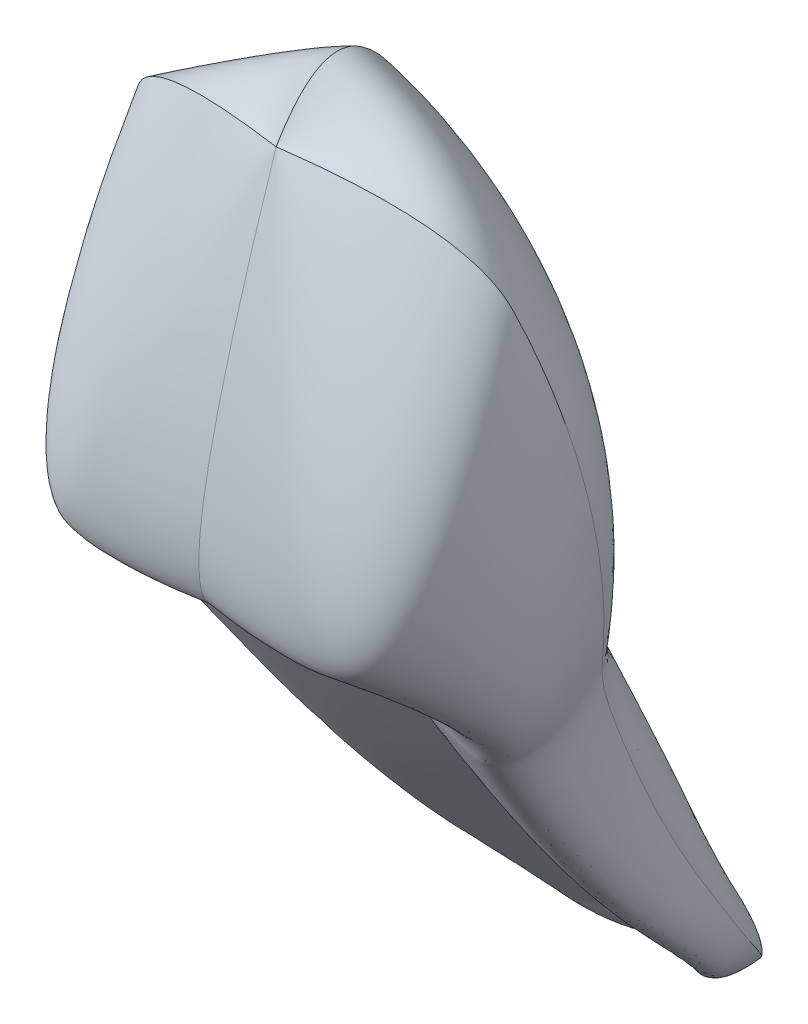
ISO-10303-21;
HEADER;
FILE_DESCRIPTION(('STEP AP214'),'2;1');
FILE_NAME('part.step','',(''),(''),'','','');
FILE_SCHEMA(('AUTOMOTIVE_DESIGN { 1 0 10303 214 1 1 1 1 }'));
ENDSEC;
DATA;
#1=APPLICATION_CONTEXT('core data for automotive mechanical design processes');
#2=APPLICATION_PROTOCOL_DEFINITION('international standard','automotive_design',2000,#1);
#3=PRODUCT_CONTEXT('',#1,'mechanical');
#4=PRODUCT('Part','Part','',(#3));
#5=PRODUCT_RELATED_PRODUCT_CATEGORY('part','',(#4));
#6=PRODUCT_DEFINITION_FORMATION('','',#4);
#7=PRODUCT_DEFINITION_CONTEXT('part definition',#1,'design');
#8=PRODUCT_DEFINITION('design','',#6,#7);
#9=PRODUCT_DEFINITION_SHAPE('','',#8);
#10=(LENGTH_UNIT() NAMED_UNIT(*) SI_UNIT(.MILLI.,.METRE.));
#11=(NAMED_UNIT(*) PLANE_ANGLE_UNIT() SI_UNIT($,.RADIAN.));
#12=(NAMED_UNIT(*) SI_UNIT($,.STERADIAN.) SOLID_ANGLE_UNIT());
#13=UNCERTAINTY_MEASURE_WITH_UNIT(LENGTH_MEASURE(1.E-05),#10,'distance_accuracy_value','');
#14=(GEOMETRIC_REPRESENTATION_CONTEXT(3) GLOBAL_UNCERTAINTY_ASSIGNED_CONTEXT((#13)) GLOBAL_UNIT_ASSIGNED_CONTEXT((#10,
#11,#12)) REPRESENTATION_CONTEXT('',''));
#15=CARTESIAN_POINT('',(0.,0.,0.));
#16=DIRECTION('',(0.,0.,1.));
#17=DIRECTION('',(1.,0.,0.));
#18=AXIS2_PLACEMENT_3D('',#15,#16,#17);
#19=CARTESIAN_POINT('',(-0.442008312540039,-230.047330925043,698.776855376468));
#20=CARTESIAN_POINT('',(-0.521462235696948,-270.186561539833,711.819726972035));
#21=CARTESIAN_POINT('',(-0.63376299136728,-280.170348342791,692.436844787852));
#22=CARTESIAN_POINT('',(-0.435320669660526,-284.064835897154,688.738625046415));
#23=CARTESIAN_POINT('',(-0.326654106740969,-309.70238284565,673.224565681323));
#24=CARTESIAN_POINT('',(-0.326654106740969,-329.155596318254,656.034050252693));
#25=CARTESIAN_POINT('',(-0.326654106740969,-335.816914858929,652.508382864654));
#26=CARTESIAN_POINT('',(-0.326654106740969,-337.033353735663,646.032564386077));
#27=CARTESIAN_POINT('',(-0.44200831254004,-230.047330925043,698.776855376468));
#28=CARTESIAN_POINT('',(-8.61464735503101,-270.621695366046,712.508229017021));
#29=CARTESIAN_POINT('',(-21.9444342998525,-281.793335648782,695.056166192246));
#30=CARTESIAN_POINT('',(-13.8211887354336,-289.365096393963,690.882263380302));
#31=CARTESIAN_POINT('',(-10.4043607260588,-311.420674536461,676.006974652497));
#32=CARTESIAN_POINT('',(-6.91460277826822,-329.751499567715,657.304402566194));
#33=CARTESIAN_POINT('',(-2.19906793420134,-335.839404422267,652.619325923999));
#34=CARTESIAN_POINT('',(-0.326654106740969,-337.033353735663,646.032564386077));
#35=CARTESIAN_POINT('',(-0.442008312540039,-230.047330925043,698.776855376468));
#36=CARTESIAN_POINT('',(-23.6611640265893,-265.128764238317,711.33274141417));
#37=CARTESIAN_POINT('',(-30.2154299263226,-279.35256710468,694.545687882062));
#38=CARTESIAN_POINT('',(-22.1064998816913,-288.759552781728,690.112782671695));
#39=CARTESIAN_POINT('',(-17.1736079784235,-311.309904013195,675.548041397517));
#40=CARTESIAN_POINT('',(-12.6236341284861,-329.560049186848,659.617156036508));
#41=CARTESIAN_POINT('',(-6.84774425839584,-337.001446680364,652.507207002736));
#42=CARTESIAN_POINT('',(-0.326654106740969,-337.033353735663,646.032564386077));
#43=CARTESIAN_POINT('',(-0.442008312540039,-230.047330925043,698.776855376468));
#44=CARTESIAN_POINT('',(-20.0252194416528,-230.387412393948,695.77622466595));
#45=CARTESIAN_POINT('',(-28.4437176150267,-258.12681396491,686.79081364888));
#46=CARTESIAN_POINT('',(-16.7658493474992,-287.449889501094,677.139133810344));
#47=CARTESIAN_POINT('',(-13.5959123569289,-306.682488838005,668.078996615542));
#48=CARTESIAN_POINT('',(-11.7129451788842,-325.827767085711,655.674301500962));
#49=CARTESIAN_POINT('',(-6.78217066595225,-337.758510313448,645.738201881493));
#50=CARTESIAN_POINT('',(-0.326654106740969,-337.033353735663,646.032564386077));
#51=(BOUNDED_SURFACE() B_SPLINE_SURFACE(2,2,((#19,#20,#21,#22,#23,#24,#25,#26),(#27,#28,#29,#30,
#31,#32,#33,#34),(#35,#36,#37,#38,#39,#40,#41,#42),(#43,#44,#45,#46,#47,#48,#49,#50)),
.UNSPECIFIED.,.F.,.F.,.F.) B_SPLINE_SURFACE_WITH_KNOTS((3,1,3),(3,1,1,1,1,1,3),
(3.14159265358979,3.68974117397993,4.71238898038469),(-1.5707963267949,-1.05220533721221,0.,
0.116900981042428,0.45584759311538,0.741777981877772,1.5707963267949),
.UNSPECIFIED.) GEOMETRIC_REPRESENTATION_ITEM() RATIONAL_B_SPLINE_SURFACE(((1.,0.935535124617778,
0.804737854124365,0.804737854124365,0.808954975739696,0.831496979097131,0.896946600754356,1.),
(0.897791342017914,0.839915335035491,0.72248667802693,0.72248667802693,0.72627277330141,
0.746510788747455,0.805270892409659,0.897791342017914),(0.809315439168634,0.757143020237719,
0.651286769826285,0.651286769826284,0.654699751458424,0.672943342805387,0.725912732100325,
0.809315439168634),(1.,0.935535124617778,0.804737854124365,0.804737854124365,0.808954975739696,
0.831496979097131,0.896946600754356,1.))) REPRESENTATION_ITEM('') SURFACE());
#52=CARTESIAN_POINT('',(-0.442008312540039,-230.047330925043,698.776855376468));
#53=CARTESIAN_POINT('',(-0.521462234334556,-270.186561539906,711.819726972148));
#54=CARTESIAN_POINT('',(-0.633762987783413,-280.170348343064,692.436844788291));
#55=CARTESIAN_POINT('',(-0.435320667383816,-284.064835898069,688.738625046785));
#56=CARTESIAN_POINT('',(-0.326654105002082,-309.702382845946,673.224565681803));
#57=CARTESIAN_POINT('',(-0.326654105604232,-329.155596318357,656.034050252912));
#58=CARTESIAN_POINT('',(-0.326654106417888,-335.816914858933,652.508382864673));
#59=CARTESIAN_POINT('',(-0.326654106740969,-337.033353735663,646.032564386077));
#60=(BOUNDED_CURVE() B_SPLINE_CURVE(2,(#52,#53,#54,#55,#56,#57,#58,#59),.UNSPECIFIED.,.F.,
.F.) B_SPLINE_CURVE_WITH_KNOTS((3,1,1,1,1,1,3),(-1.5707963267949,-1.05220533721221,0.,
0.116900981042428,0.45584759311538,0.741777981877772,1.5707963267949),
.UNSPECIFIED.) CURVE() GEOMETRIC_REPRESENTATION_ITEM() RATIONAL_B_SPLINE_CURVE((0.999999999980356,
0.935535124599401,0.804737854108557,0.804737854108557,0.808954975723805,0.831496979080798,
0.896946600736737,0.999999999980356)) REPRESENTATION_ITEM(''));
#61=CARTESIAN_POINT('',(-0.44200831254004,-230.047330925043,698.776855376468));
#62=VERTEX_POINT('',#61);
#63=CARTESIAN_POINT('',(-0.326654106740969,-337.033353735663,646.032564386077));
#64=VERTEX_POINT('',#63);
#65=EDGE_CURVE('E42',#62,#64,#60,.T.);
#66=CARTESIAN_POINT('',(-0.442008312540039,-230.047330925043,698.776855376468));
#67=CARTESIAN_POINT('',(-20.0252194416528,-230.387412393948,695.77622466595));
#68=CARTESIAN_POINT('',(-28.4437176150267,-258.12681396491,686.79081364888));
#69=CARTESIAN_POINT('',(-16.7658493474992,-287.449889501094,677.139133810344));
#70=CARTESIAN_POINT('',(-13.5959123569289,-306.682488838005,668.078996615542));
#71=CARTESIAN_POINT('',(-11.7129451788842,-325.827767085711,655.674301500962));
#72=CARTESIAN_POINT('',(-6.78217066595225,-337.758510313448,645.738201881493));
#73=CARTESIAN_POINT('',(-0.326654106740969,-337.033353735663,646.032564386077));
#74=(BOUNDED_CURVE() B_SPLINE_CURVE(2,(#66,#67,#68,#69,#70,#71,#72,#73),.UNSPECIFIED.,.F.,
.F.) B_SPLINE_CURVE_WITH_KNOTS((3,1,1,1,1,1,3),(-1.5707963267949,-1.05220533721221,0.,
0.116900981042428,0.45584759311538,0.741777981877772,1.5707963267949),
.UNSPECIFIED.) CURVE() GEOMETRIC_REPRESENTATION_ITEM() RATIONAL_B_SPLINE_CURVE((1.,
0.935535124617778,0.804737854124365,0.804737854124365,0.808954975739696,0.831496979097131,
0.896946600754356,1.)) REPRESENTATION_ITEM(''));
#75=EDGE_CURVE('E43',#62,#64,#74,.T.);
#76=ORIENTED_EDGE('',*,*,#65,.F.);
#77=ORIENTED_EDGE('',*,*,#75,.T.);
#78=EDGE_LOOP('',(#76,#77));
#79=FACE_BOUND('',#78,.T.);
#80=ADVANCED_FACE('F16',(#79),#51,.T.);
#81=CARTESIAN_POINT('',(-0.442008312540039,-230.047330925043,698.776855376468));
#82=CARTESIAN_POINT('',(-20.0252194416528,-230.387412393948,695.77622466595));
#83=CARTESIAN_POINT('',(-28.4437176150267,-258.12681396491,686.79081364888));
#84=CARTESIAN_POINT('',(-16.7658493474992,-287.449889501094,677.139133810344));
#85=CARTESIAN_POINT('',(-13.5959123569289,-306.682488838005,668.078996615542));
#86=CARTESIAN_POINT('',(-11.7129451788842,-325.827767085711,655.674301500962));
#87=CARTESIAN_POINT('',(-6.78217066595225,-337.758510313448,645.738201881493));
#88=CARTESIAN_POINT('',(-0.326654106740969,-337.033353735663,646.032564386077));
#89=CARTESIAN_POINT('',(-0.44200831254004,-230.047330925043,698.776855376468));
#90=CARTESIAN_POINT('',(-9.04420416512185,-227.131093767181,690.514973674271));
#91=CARTESIAN_POINT('',(-28.1188309611171,-249.024554216994,672.035723382284));
#92=CARTESIAN_POINT('',(-13.9598882417454,-283.653567593063,670.897990398088));
#93=CARTESIAN_POINT('',(-13.5959123569289,-304.455144788991,660.255566190757));
#94=CARTESIAN_POINT('',(-11.7129451788842,-317.387625837963,655.362283685104));
#95=CARTESIAN_POINT('',(-6.78217066595225,-336.381526166893,644.56657475043));
#96=CARTESIAN_POINT('',(-0.326654106740969,-337.033353735663,646.032564386077));
#97=CARTESIAN_POINT('',(-0.442008312540039,-230.047330925043,698.776855376468));
#98=CARTESIAN_POINT('',(-0.40940659359147,-221.711217307384,693.909066524843));
#99=CARTESIAN_POINT('',(-0.327038166302166,-231.314460310745,677.899858676672));
#100=CARTESIAN_POINT('',(-0.32665410674097,-283.320276531391,671.281548833746));
#101=CARTESIAN_POINT('',(-0.326654106740969,-304.222829996604,660.529590363288));
#102=CARTESIAN_POINT('',(-0.326654106740969,-317.243426212786,655.498097357232));
#103=CARTESIAN_POINT('',(-0.326654106740969,-335.937569706043,644.308329500977));
#104=CARTESIAN_POINT('',(-0.326654106740969,-337.033353735663,646.032564386077));
#105=(BOUNDED_SURFACE() B_SPLINE_SURFACE(2,2,((#81,#82,#83,#84,#85,#86,#87,#88),(#89,#90,#91,
#92,#93,#94,#95,#96),(#97,#98,#99,#100,#101,#102,#103,#104)),.UNSPECIFIED.,.F.,.F.,
.F.) B_SPLINE_SURFACE_WITH_KNOTS((3,3),(3,1,1,1,1,1,3),(4.71238898038469,6.28318530717959),
(-1.5707963267949,-1.05220533721221,0.,0.116900981042428,0.45584759311538,0.741777981877772,
1.5707963267949),.UNSPECIFIED.) GEOMETRIC_REPRESENTATION_ITEM() RATIONAL_B_SPLINE_SURFACE(((1.,
0.935535124617778,0.804737854124365,0.804737854124365,0.808954975739696,0.831496979097131,
0.896946600754356,1.),(0.707106781186547,0.661523230655433,0.569035593728849,0.569035593728849,
0.572017549020138,0.587957152455711,0.634237023755628,0.707106781186547),(1.,0.935535124617778,
0.804737854124365,0.804737854124365,0.808954975739696,0.831496979097131,0.896946600754356,1.))) REPRESENTATION_ITEM('') SURFACE());
#106=CARTESIAN_POINT('',(-0.326654106740969,-337.033353735663,646.032564386077));
#107=CARTESIAN_POINT('',(-0.326654106740645,-337.030123629031,646.027481370276));
#108=CARTESIAN_POINT('',(-0.326654106740321,-337.026801087649,646.022457049084));
#109=CARTESIAN_POINT('',(-0.326654106739674,-337.019977973357,646.01253736145));
#110=CARTESIAN_POINT('',(-0.326654106739352,-337.016477561154,646.00764188446));
#111=CARTESIAN_POINT('',(-0.326654106738707,-337.009298218827,645.997980279793));
#112=CARTESIAN_POINT('',(-0.326654106738385,-337.005619211073,645.993214209793));
#113=CARTESIAN_POINT('',(-0.326654106737743,-336.998082460576,645.983811647489));
#114=CARTESIAN_POINT('',(-0.326654106737422,-336.994224412058,645.979175400298));
#115=CARTESIAN_POINT('',(-0.326654106736782,-336.986329278209,645.970032732117));
#116=CARTESIAN_POINT('',(-0.326654106736462,-336.982291673014,645.965526760112));
#117=CARTESIAN_POINT('',(-0.326654106735824,-336.974037129147,645.956644864608));
#118=CARTESIAN_POINT('',(-0.326654106735505,-336.969819474094,645.95226960704));
#119=CARTESIAN_POINT('',(-0.326654106734869,-336.961204510627,645.943649353143));
#120=CARTESIAN_POINT('',(-0.326654106734551,-336.956806309642,645.939405249109));
#121=CARTESIAN_POINT('',(-0.326654106733917,-336.94782991534,645.93104750565));
#122=CARTESIAN_POINT('',(-0.3266541067336,-336.943250675763,645.926934990367));
#123=CARTESIAN_POINT('',(-0.326654106732969,-336.933911842445,645.918840623314));
#124=CARTESIAN_POINT('',(-0.326654106732653,-336.929151072671,645.914860129019));
#125=CARTESIAN_POINT('',(-0.326654106732023,-336.919448793693,645.907030002139));
#126=CARTESIAN_POINT('',(-0.326654106731709,-336.91450600329,645.903181957946));
#127=CARTESIAN_POINT('',(-0.326654106731081,-336.904439273364,645.895616932466));
#128=CARTESIAN_POINT('',(-0.326654106730767,-336.899313972061,645.891901764405));
#129=CARTESIAN_POINT('',(-0.326654106730142,-336.88888178811,645.884602699617));
#130=CARTESIAN_POINT('',(-0.326654106729829,-336.883573487049,645.881020831569));
#131=CARTESIAN_POINT('',(-0.326654106729206,-336.872774843654,645.87398858295));
#132=CARTESIAN_POINT('',(-0.326654106728894,-336.867283048944,645.87054043425));
#133=CARTESIAN_POINT('',(-0.326654106728273,-336.85611695497,645.863775860993));
#134=CARTESIAN_POINT('',(-0.326654106727963,-336.850441190682,645.860461857033));
#135=CARTESIAN_POINT('',(-0.326654106727344,-336.838906605426,645.853965794));
#136=CARTESIAN_POINT('',(-0.326654106727034,-336.83304632491,645.850786327454));
#137=CARTESIAN_POINT('',(-0.326654106726417,-336.821142401068,645.84455969274));
#138=CARTESIAN_POINT('',(-0.326654106726109,-336.815097324517,645.841515273152));
#139=CARTESIAN_POINT('',(-0.326654106725179,-336.796535294413,645.832507674649));
#140=CARTESIAN_POINT('',(-0.326654106724566,-336.783878208421,645.826831044932));
#141=CARTESIAN_POINT('',(-0.326654106723344,-336.757830131521,645.81599931722));
#142=CARTESIAN_POINT('',(-0.326654106722735,-336.744428899408,645.810869055859));
#143=CARTESIAN_POINT('',(-0.326654106721522,-336.716886383349,645.801131340633));
#144=CARTESIAN_POINT('',(-0.326654106720918,-336.702735954726,645.796549854446));
#145=CARTESIAN_POINT('',(-0.326654106719713,-336.673690184114,645.787912287474));
#146=CARTESIAN_POINT('',(-0.326654106719113,-336.658786978733,645.783882814419));
#147=CARTESIAN_POINT('',(-0.326654106717917,-336.628230298696,645.77635213331));
#148=CARTESIAN_POINT('',(-0.326654106717322,-336.612570262656,645.772877720336));
#149=CARTESIAN_POINT('',(-0.326654106716135,-336.580494694369,645.766460485474));
#150=CARTESIAN_POINT('',(-0.326654106715544,-336.564073876081,645.763544285933));
#151=CARTESIAN_POINT('',(-0.326654106714366,-336.530471544446,645.758247097287));
#152=CARTESIAN_POINT('',(-0.326654106713779,-336.513285942226,645.755892273437));
#153=CARTESIAN_POINT('',(-0.326654106712609,-336.478148995777,645.751721742467));
#154=CARTESIAN_POINT('',(-0.326654106712027,-336.46019465862,645.749931533748));
#155=CARTESIAN_POINT('',(-0.326654106710866,-336.423515189786,645.746894161095));
#156=CARTESIAN_POINT('',(-0.326654106710289,-336.404788040063,645.745671672498));
#157=CARTESIAN_POINT('',(-0.326654106709137,-336.36655856223,645.743774389344));
#158=CARTESIAN_POINT('',(-0.326654106708564,-336.347055093939,645.743123372109));
#159=CARTESIAN_POINT('',(-0.326654106706815,-336.286200866729,645.741973219323));
#160=CARTESIAN_POINT('',(-0.326654106705685,-336.244830134914,645.74245963562));
#161=CARTESIAN_POINT('',(-0.326654106703433,-336.15893786717,645.745584404141));
#162=CARTESIAN_POINT('',(-0.326654106702321,-336.114423190794,645.748388225928));
#163=CARTESIAN_POINT('',(-0.326654106700106,-336.022200084394,645.756190653053));
#164=CARTESIAN_POINT('',(-0.32665410669901,-335.974504678875,645.761339186648));
#165=CARTESIAN_POINT('',(-0.326654106696832,-335.875885887478,645.773871487336));
#166=CARTESIAN_POINT('',(-0.326654106695755,-335.824980050158,645.781390599995));
#167=CARTESIAN_POINT('',(-0.326654106693613,-335.719906888994,645.798703706283));
#168=CARTESIAN_POINT('',(-0.326654106692554,-335.665759939939,645.808619856779));
#169=CARTESIAN_POINT('',(-0.326654106690449,-335.554173026769,645.830764100117));
#170=CARTESIAN_POINT('',(-0.326654106689408,-335.496755137506,645.843102490286));
#171=CARTESIAN_POINT('',(-0.32665410668734,-335.378597832916,645.870130184492));
#172=CARTESIAN_POINT('',(-0.326654106686318,-335.317881481016,645.884919496296));
#173=CARTESIAN_POINT('',(-0.32665410668318,-335.125061249231,645.934291924253));
#174=CARTESIAN_POINT('',(-0.326654106681203,-334.993644357992,645.971558592169));
#175=CARTESIAN_POINT('',(-0.32665410667729,-334.717109261462,646.055541164711));
#176=CARTESIAN_POINT('',(-0.326654106675387,-334.572175273667,646.102851966324));
#177=CARTESIAN_POINT('',(-0.326654106671626,-334.268392806578,646.207225882728));
#178=CARTESIAN_POINT('',(-0.326654106669797,-334.109717902904,646.264790765271));
#179=CARTESIAN_POINT('',(-0.326654106666191,-333.778273920816,646.389949913914));
#180=CARTESIAN_POINT('',(-0.326654106664438,-333.60566788986,646.457972641417));
#181=CARTESIAN_POINT('',(-0.326654106659027,-333.042357488565,646.687131336962));
#182=CARTESIAN_POINT('',(-0.326654106655801,-332.654871759118,646.856153413002));
#183=CARTESIAN_POINT('',(-0.326654106649527,-331.820986922258,647.235596960263));
#184=CARTESIAN_POINT('',(-0.326654106646599,-331.375601865182,647.448208416921));
#185=CARTESIAN_POINT('',(-0.32665410664096,-330.424884989236,647.916634185225));
#186=CARTESIAN_POINT('',(-0.326654106638343,-329.92041630811,648.174191085011));
#187=CARTESIAN_POINT('',(-0.326654106633347,-328.850705009052,648.733899313555));
#188=CARTESIAN_POINT('',(-0.326654106631045,-328.286203250461,649.037458097855));
#189=CARTESIAN_POINT('',(-0.326654106626694,-327.095810250995,649.690321225608));
#190=CARTESIAN_POINT('',(-0.326654106624709,-326.470558917866,650.040788222361));
#191=CARTESIAN_POINT('',(-0.326654106621005,-325.158295797481,650.788364129724));
#192=CARTESIAN_POINT('',(-0.326654106619337,-324.47184113884,651.186448474206));
#193=CARTESIAN_POINT('',(-0.326654106617094,-323.420750745321,651.804308646619));
#194=CARTESIAN_POINT('',(-0.326654106616371,-323.054420260539,652.02121171032));
#195=CARTESIAN_POINT('',(-0.326654106615528,-322.59470500739,652.295225225784));
#196=CARTESIAN_POINT('',(-0.32665410661536,-322.500725102058,652.351337742503));
#197=CARTESIAN_POINT('',(-0.326654106615027,-322.311952950007,652.464179000815));
#198=CARTESIAN_POINT('',(-0.326654106614863,-322.217161236745,652.52090863842));
#199=CARTESIAN_POINT('',(-0.326654106614379,-321.931367898607,652.690818347162));
#200=CARTESIAN_POINT('',(-0.326654106614065,-321.739866133412,652.80315880595));
#201=CARTESIAN_POINT('',(-0.326654106613459,-321.354652073448,653.026624671578));
#202=CARTESIAN_POINT('',(-0.326654106613166,-321.160933401556,653.13773906661));
#203=CARTESIAN_POINT('',(-0.326654106612599,-320.771242827049,653.358633734065));
#204=CARTESIAN_POINT('',(-0.326654106612325,-320.575264372379,653.468402453698));
#205=CARTESIAN_POINT('',(-0.326654106611532,-319.982295486315,653.796643974016));
#206=CARTESIAN_POINT('',(-0.326654106611044,-319.583635506376,654.0121007232));
#207=CARTESIAN_POINT('',(-0.326654106609688,-318.367706050059,654.653797833512));
#208=CARTESIAN_POINT('',(-0.326654106608948,-317.543834270948,655.067625668112));
#209=CARTESIAN_POINT('',(-0.326654106608065,-316.289724648619,655.667624281081));
#210=CARTESIAN_POINT('',(-0.326654106607807,-315.86511547619,655.865686819287));
#211=CARTESIAN_POINT('',(-0.326654106607477,-315.223694036337,656.157438240248));
#212=CARTESIAN_POINT('',(-0.326654106607376,-315.008267559728,656.254173180258));
#213=CARTESIAN_POINT('',(-0.326654106607192,-314.575359833442,656.446087436889));
#214=CARTESIAN_POINT('',(-0.32665410660711,-314.357873741517,656.541255828913));
#215=CARTESIAN_POINT('',(-0.326654106606963,-313.920869483952,656.730013865442));
#216=CARTESIAN_POINT('',(-0.326654106606899,-313.701346637351,656.823592672282));
#217=CARTESIAN_POINT('',(-0.32665410660679,-313.260293674868,657.009151407579));
#218=CARTESIAN_POINT('',(-0.326654106606744,-313.038759045254,657.101120605684));
#219=CARTESIAN_POINT('',(-0.32665410660667,-312.593703451316,657.283430174507));
#220=CARTESIAN_POINT('',(-0.326654106606643,-312.370178115585,657.373759876582));
#221=CARTESIAN_POINT('',(-0.326654106606614,-312.033850228335,657.507871638338));
#222=CARTESIAN_POINT('',(-0.326654106606607,-311.921355630525,657.552427359943));
#223=CARTESIAN_POINT('',(-0.326654106606597,-311.695866569699,657.64109032356));
#224=CARTESIAN_POINT('',(-0.326654106606595,-311.582871559434,657.685196173311));
#225=CARTESIAN_POINT('',(-0.326654106606594,-311.355593532999,657.773450437642));
#226=CARTESIAN_POINT('',(-0.326654106606595,-311.24130896069,657.817594846224));
#227=CARTESIAN_POINT('',(-0.326654106606603,-311.009609256848,657.908066907421));
#228=CARTESIAN_POINT('',(-0.32665410660661,-310.89220412036,657.954420193181));
#229=CARTESIAN_POINT('',(-0.326654106606635,-310.529568127898,658.098604632461));
#230=CARTESIAN_POINT('',(-0.326654106606661,-310.284716493914,658.197389113406));
#231=CARTESIAN_POINT('',(-0.326654106606729,-309.781611973718,658.403073014725));
#232=CARTESIAN_POINT('',(-0.326654106606773,-309.523414850336,658.510108688477));
#233=CARTESIAN_POINT('',(-0.326654106606875,-308.993590687865,658.732274017595));
#234=CARTESIAN_POINT('',(-0.326654106606935,-308.722013826292,658.847523136063));
#235=CARTESIAN_POINT('',(-0.326654106607146,-307.865673581496,659.214650134943));
#236=CARTESIAN_POINT('',(-0.326654106607323,-307.282473183708,659.470175197317));
#237=CARTESIAN_POINT('',(-0.326654106607724,-306.062186255523,660.013486223828));
#238=CARTESIAN_POINT('',(-0.326654106607951,-305.425416511311,660.301980704927));
#239=CARTESIAN_POINT('',(-0.326654106608521,-304.098084966813,660.911412523089));
#240=CARTESIAN_POINT('',(-0.326654106608872,-303.407797500624,661.232946394678));
#241=CARTESIAN_POINT('',(-0.326654106609403,-301.973581829145,661.908547203263));
#242=CARTESIAN_POINT('',(-0.326654106609567,-301.229892867223,662.263121115206));
#243=CARTESIAN_POINT('',(-0.326654106610917,-299.68908769996,663.004836385179));
#244=CARTESIAN_POINT('',(-0.326654106612178,-298.892181639302,663.392413754515));
#245=CARTESIAN_POINT('',(-0.326654106610752,-297.245219194143,664.200111606505));
#246=CARTESIAN_POINT('',(-0.326654106607782,-296.395348564665,664.620610443318));
#247=CARTESIAN_POINT('',(-0.326654106618426,-294.642796142476,665.494071366271));
#248=CARTESIAN_POINT('',(-0.326654106633133,-293.740279328295,665.947364259638));
#249=CARTESIAN_POINT('',(-0.326654106604838,-292.367714392187,666.641192922374));
#250=CARTESIAN_POINT('',(-0.326654106586025,-291.89680875793,666.880034880679));
#251=CARTESIAN_POINT('',(-0.326654106645667,-290.941968832544,667.365816435576));
#252=CARTESIAN_POINT('',(-0.326654106726954,-290.458051976244,667.612790305985));
#253=CARTESIAN_POINT('',(-0.326654106559854,-289.727535451962,667.986721008897));
#254=CARTESIAN_POINT('',(-0.326654106453362,-289.480717071206,668.113250455521));
#255=CARTESIAN_POINT('',(-0.326654106699356,-289.109323433546,668.303891306864));
#256=CARTESIAN_POINT('',(-0.326654106850789,-288.98469789237,668.367905314397));
#257=CARTESIAN_POINT('',(-0.326654106382213,-288.734929169097,668.496331959783));
#258=CARTESIAN_POINT('',(-0.326654105758669,-288.60978623016,668.560745080651));
#259=CARTESIAN_POINT('',(-0.326654155105528,-288.235321413034,668.7507913413));
#260=CARTESIAN_POINT('',(-0.326654255442752,-287.984927525592,668.874323609151));
#261=CARTESIAN_POINT('',(-0.326654580052908,-287.484685745929,669.114619217436));
#262=CARTESIAN_POINT('',(-0.326654802793674,-287.234868691245,669.231446907002));
#263=CARTESIAN_POINT('',(-0.326655375987015,-286.735702576983,669.458164487513));
#264=CARTESIAN_POINT('',(-0.326655724879084,-286.486383704601,669.568120681038));
#265=CARTESIAN_POINT('',(-0.326656549408014,-285.988255707186,669.7811274798));
#266=CARTESIAN_POINT('',(-0.326657023518785,-285.73947456668,669.884243681118));
#267=CARTESIAN_POINT('',(-0.326658627424415,-284.99802651699,670.181555308049));
#268=CARTESIAN_POINT('',(-0.326659948096123,-284.502003654349,670.367470443858));
#269=CARTESIAN_POINT('',(-0.326663103449501,-283.511979860078,670.711319642334));
#270=CARTESIAN_POINT('',(-0.326664926753461,-283.018155249855,670.869759357433));
#271=CARTESIAN_POINT('',(-0.326668060958463,-282.275563626516,671.087434228497));
#272=CARTESIAN_POINT('',(-0.326669162555531,-282.029568713555,671.156220290827));
#273=CARTESIAN_POINT('',(-0.326671492832021,-281.538146316318,671.286856183067));
#274=CARTESIAN_POINT('',(-0.326672720256562,-281.292734231364,671.348763714768));
#275=CARTESIAN_POINT('',(-0.326675300590483,-280.802494497222,671.465634607563));
#276=CARTESIAN_POINT('',(-0.326676652328543,-280.557680006545,671.520653164741));
#277=CARTESIAN_POINT('',(-0.326679486709105,-280.068649226522,671.623762312644));
#278=CARTESIAN_POINT('',(-0.326680968212375,-279.824443939293,671.671905023206));
#279=CARTESIAN_POINT('',(-0.326684041616034,-279.336631499254,671.761203633291));
#280=CARTESIAN_POINT('',(-0.326685632614421,-279.093033382855,671.802408785495));
#281=CARTESIAN_POINT('',(-0.326688162466448,-278.727513839053,671.859236725729));
#282=CARTESIAN_POINT('',(-0.32668902721065,-278.605969694686,671.877308837051));
#283=CARTESIAN_POINT('',(-0.326690707608154,-278.363007530415,671.911489085868));
#284=CARTESIAN_POINT('',(-0.326691523411288,-278.24159037558,671.927603390748));
#285=CARTESIAN_POINT('',(-0.326693492509875,-277.999012363608,671.959001118104));
#286=CARTESIAN_POINT('',(-0.32669464481391,-277.877851791994,671.974286827176));
#287=CARTESIAN_POINT('',(-0.326697674582296,-277.635906193252,672.00516536449));
#288=CARTESIAN_POINT('',(-0.326699550053873,-277.515121045649,672.020757237971));
#289=CARTESIAN_POINT('',(-0.326706112796095,-277.153778315971,672.067512061462));
#290=CARTESIAN_POINT('',(-0.32671174402984,-276.913234814938,672.09878221682));
#291=CARTESIAN_POINT('',(-0.326725608719083,-276.43355244582,672.161656764589));
#292=CARTESIAN_POINT('',(-0.326733827522817,-276.194413208492,672.193258329583));
#293=CARTESIAN_POINT('',(-0.32675284752793,-275.717541530982,672.256736976906));
#294=CARTESIAN_POINT('',(-0.326763633930385,-275.479808750272,672.288611506517));
#295=CARTESIAN_POINT('',(-0.326799768443117,-274.7707761967,672.384391921371));
#296=CARTESIAN_POINT('',(-0.326829008760752,-274.299569409963,672.448988451697));
#297=CARTESIAN_POINT('',(-0.326897887797812,-273.362899535281,672.579324419118));
#298=CARTESIAN_POINT('',(-0.326937401642059,-272.897433375879,672.645041830232));
#299=CARTESIAN_POINT('',(-0.32707071000948,-271.518121965938,672.842696086586));
#300=CARTESIAN_POINT('',(-0.327180107455158,-270.604668799047,672.97738761358));
#301=CARTESIAN_POINT('',(-0.327440910714441,-268.801575862363,673.251319352763));
#302=CARTESIAN_POINT('',(-0.327591209599334,-267.911906352412,673.390364428622));
#303=CARTESIAN_POINT('',(-0.328097984823302,-265.314285965922,673.80854974307));
#304=CARTESIAN_POINT('',(-0.328516798147408,-263.608080215816,674.098670919516));
#305=CARTESIAN_POINT('',(-0.329525349717335,-260.296758995493,674.696894019659));
#306=CARTESIAN_POINT('',(-0.330104278961503,-258.691301837097,675.003096832585));
#307=CARTESIAN_POINT('',(-0.331431712450364,-255.584680025417,675.632837475558));
#308=CARTESIAN_POINT('',(-0.332167846996066,-254.083078817673,675.954207713108));
#309=CARTESIAN_POINT('',(-0.333807742762295,-251.186846824543,676.61359586986));
#310=CARTESIAN_POINT('',(-0.334697351036655,-249.791656890076,676.949141225596));
#311=CARTESIAN_POINT('',(-0.336641813743074,-247.110385925171,677.636182588899));
#312=CARTESIAN_POINT('',(-0.337680464684442,-245.823587195701,677.984857560795));
#313=CARTESIAN_POINT('',(-0.339920254999642,-243.36068802945,678.697462493131));
#314=CARTESIAN_POINT('',(-0.341102831113635,-242.183664470415,679.058173288066));
#315=CARTESIAN_POINT('',(-0.343627533653182,-239.941438137132,679.794180589789));
#316=CARTESIAN_POINT('',(-0.34494837534789,-238.875038241871,680.165803447086));
#317=CARTESIAN_POINT('',(-0.347746339717976,-236.854524818308,680.922988812467));
#318=CARTESIAN_POINT('',(-0.349199079493376,-235.898867036827,681.304364712546));
#319=CARTESIAN_POINT('',(-0.351550781422069,-234.516310378696,681.901025853604));
#320=CARTESIAN_POINT('',(-0.35232924166878,-234.080533819919,682.095777499308));
#321=CARTESIAN_POINT('',(-0.353920755470232,-233.236892158482,682.487981460752));
#322=CARTESIAN_POINT('',(-0.354730054616566,-232.828732033096,682.684796343556));
#323=CARTESIAN_POINT('',(-0.356382495918548,-232.040250486433,683.081001128634));
#324=CARTESIAN_POINT('',(-0.357221643517793,-231.659590906171,683.27971588087));
#325=CARTESIAN_POINT('',(-0.358933167088468,-230.926013429069,683.679622185968));
#326=CARTESIAN_POINT('',(-0.359801298124296,-230.572707878812,683.880099834075));
#327=CARTESIAN_POINT('',(-0.36157011866298,-229.893718929498,684.283426616556));
#328=CARTESIAN_POINT('',(-0.362466319419942,-229.567591463096,684.485525143151));
#329=CARTESIAN_POINT('',(-0.364290607000771,-228.942814245795,684.891991056172));
#330=CARTESIAN_POINT('',(-0.365213975863373,-228.64365703732,685.09557463274));
#331=CARTESIAN_POINT('',(-0.36709185697832,-228.072666760843,685.50489654289));
#332=CARTESIAN_POINT('',(-0.368041455701696,-227.800255310895,685.709824859104));
#333=CARTESIAN_POINT('',(-0.369971128103643,-227.282544965439,686.121742791312));
#334=CARTESIAN_POINT('',(-0.370946138808775,-227.036593279462,686.327904908542));
#335=CARTESIAN_POINT('',(-0.37245297344069,-226.68268032529,686.64322033137));
#336=CARTESIAN_POINT('',(-0.372950314045847,-226.569737377052,686.746805089932));
#337=CARTESIAN_POINT('',(-0.373951619426992,-226.350469161552,686.9543314372));
#338=CARTESIAN_POINT('',(-0.374454944760592,-226.244046986469,687.058170335857));
#339=CARTESIAN_POINT('',(-0.375468071886461,-226.037788097514,687.266182477382));
#340=CARTESIAN_POINT('',(-0.375977240525906,-225.937849693275,687.370254762666));
#341=CARTESIAN_POINT('',(-0.377001931830088,-225.744522571746,687.578716194076));
#342=CARTESIAN_POINT('',(-0.377516831540175,-225.651027751167,687.683006770454));
#343=CARTESIAN_POINT('',(-0.378552843112663,-225.470549308342,687.891884103581));
#344=CARTESIAN_POINT('',(-0.379073347950089,-225.383455679483,687.996375645398));
#345=CARTESIAN_POINT('',(-0.380120448590695,-225.215744630996,688.205637669637));
#346=CARTESIAN_POINT('',(-0.380646458337203,-225.135013826503,688.310317126495));
#347=CARTESIAN_POINT('',(-0.38170435273737,-224.979971568457,688.519922860535));
#348=CARTESIAN_POINT('',(-0.382235680869257,-224.905544797256,688.624763674948));
#349=CARTESIAN_POINT('',(-0.383304305228089,-224.763122507955,688.834709014502));
#350=CARTESIAN_POINT('',(-0.383841072291901,-224.6950089825,688.939733287751));
#351=CARTESIAN_POINT('',(-0.384654925833108,-224.596874131716,689.098321758105));
#352=CARTESIAN_POINT('',(-0.384924903365337,-224.56513479972,689.150826751648));
#353=CARTESIAN_POINT('',(-0.385466491619045,-224.50374579562,689.255878156261));
#354=CARTESIAN_POINT('',(-0.385737999979212,-224.474070098009,689.308409267425));
#355=CARTESIAN_POINT('',(-0.386282370188517,-224.416846281889,689.413458026918));
#356=CARTESIAN_POINT('',(-0.386555129888265,-224.389270499802,689.465960609695));
#357=CARTESIAN_POINT('',(-0.387101977200958,-224.336234588841,689.57094911283));
#358=CARTESIAN_POINT('',(-0.38737597013261,-224.310747234137,689.623421261354));
#359=CARTESIAN_POINT('',(-0.387925261591521,-224.261879678508,689.728345910215));
#360=CARTESIAN_POINT('',(-0.388200473369332,-224.238472848152,689.780785996148));
#361=CARTESIAN_POINT('',(-0.38875217868768,-224.193756548787,689.885643406647));
#362=CARTESIAN_POINT('',(-0.3890285938571,-224.172421297726,689.938049724516));
#363=CARTESIAN_POINT('',(-0.389582681985037,-224.131838287258,690.042836472495));
#364=CARTESIAN_POINT('',(-0.389860285257074,-224.112565836168,690.095207329382));
#365=CARTESIAN_POINT('',(-0.390416725274845,-224.076098149432,690.199920015856));
#366=CARTESIAN_POINT('',(-0.390695501187718,-224.058879566427,690.252253705433));
#367=CARTESIAN_POINT('',(-0.391254262069091,-224.026509014419,690.356888938789));
#368=CARTESIAN_POINT('',(-0.391534195065035,-224.011335295314,690.409183746366));
#369=CARTESIAN_POINT('',(-0.392095245739738,-223.983043526098,690.513738146909));
#370=CARTESIAN_POINT('',(-0.392376320138026,-223.969905569607,690.565992347333));
#371=CARTESIAN_POINT('',(-0.392939629479518,-223.94567405372,690.670462546667));
#372=CARTESIAN_POINT('',(-0.393221829482993,-223.934562663852,690.722674405269));
#373=CARTESIAN_POINT('',(-0.393787366320158,-223.91437269948,690.827057047832));
#374=CARTESIAN_POINT('',(-0.394070676020208,-223.90527858074,690.879224821894));
#375=CARTESIAN_POINT('',(-0.394638409147377,-223.889111293793,690.98351656674));
#376=CARTESIAN_POINT('',(-0.394922812537102,-223.88202504861,691.035638508178));
#377=CARTESIAN_POINT('',(-0.395492710729132,-223.869861394429,691.139836031491));
#378=CARTESIAN_POINT('',(-0.395778191722066,-223.864773520714,691.191910390528));
#379=CARTESIAN_POINT('',(-0.396350223752324,-223.856594285829,691.296010388653));
#380=CARTESIAN_POINT('',(-0.396636766206714,-223.8534951756,691.348035418359));
#381=CARTESIAN_POINT('',(-0.397210900867812,-223.849280980106,691.452034611248));
#382=CARTESIAN_POINT('',(-0.39749848861514,-223.848160919243,691.504008572713));
#383=CARTESIAN_POINT('',(-0.398074694741416,-223.84789221977,691.607903707621));
#384=CARTESIAN_POINT('',(-0.398363311617648,-223.848741389097,691.659824875457));
#385=CARTESIAN_POINT('',(-0.398941558108379,-223.852398482449,691.763612730687));
#386=CARTESIAN_POINT('',(-0.399231187986129,-223.855206960182,691.815479398527));
#387=CARTESIAN_POINT('',(-0.399811443828351,-223.862769987633,691.919156787018));
#388=CARTESIAN_POINT('',(-0.400102070648096,-223.867527753144,691.970967272689));
#389=CARTESIAN_POINT('',(-0.400684304937921,-223.878976705314,692.074531045275));
#390=CARTESIAN_POINT('',(-0.400975912736462,-223.885673644046,692.126283695334));
#391=CARTESIAN_POINT('',(-0.401560094698059,-223.900988366289,692.229730743507));
#392=CARTESIAN_POINT('',(-0.401852667632931,-223.909614275591,692.281423936934));
#393=CARTESIAN_POINT('',(-0.402438766634004,-223.928774473698,692.38475119495));
#394=CARTESIAN_POINT('',(-0.4027322890022,-223.939319069249,692.436383345744));
#395=CARTESIAN_POINT('',(-0.403320274567109,-223.962304315469,692.539587792255));
#396=CARTESIAN_POINT('',(-0.403614730819719,-223.974757238148,692.591157351243));
#397=CARTESIAN_POINT('',(-0.40420457263411,-224.001546976837,692.694236009451));
#398=CARTESIAN_POINT('',(-0.404499947378648,-224.01589779902,692.745741463946));
#399=CARTESIAN_POINT('',(-0.405091615308102,-224.04647135379,692.848691404096));
#400=CARTESIAN_POINT('',(-0.405387893329702,-224.062709587575,692.900131280723));
#401=CARTESIAN_POINT('',(-0.405981357368163,-224.097046162191,693.002949610702));
#402=CARTESIAN_POINT('',(-0.406278523553672,-224.115161258808,693.054322461784));
#403=CARTESIAN_POINT('',(-0.406873754021978,-224.15323996063,693.157006360068));
#404=CARTESIAN_POINT('',(-0.407171793629675,-224.173221340789,693.208310808572));
#405=CARTESIAN_POINT('',(-0.407768760413484,-224.215021117303,693.310857394541));
#406=CARTESIAN_POINT('',(-0.408067658014284,-224.2368580811,693.362091954133));
#407=CARTESIAN_POINT('',(-0.408666333435789,-224.282357984397,693.4644987737));
#408=CARTESIAN_POINT('',(-0.408966076886049,-224.306040075089,693.515662520828));
#409=CARTESIAN_POINT('',(-0.409566424767598,-224.35521827896,693.617925694072));
#410=CARTESIAN_POINT('',(-0.409866990047563,-224.380733917975,693.669015700238));
#411=CARTESIAN_POINT('',(-0.410776238580979,-224.460536405608,693.823253154047));
#412=CARTESIAN_POINT('',(-0.411379917401214,-224.517120329393,693.925220570594));
#413=CARTESIAN_POINT('',(-0.412590737725335,-224.637332752704,694.128927096444));
#414=CARTESIAN_POINT('',(-0.413197466168616,-224.701118643415,694.230572704602));
#415=CARTESIAN_POINT('',(-0.414414385617946,-224.835655109383,694.433645259527));
#416=CARTESIAN_POINT('',(-0.415024114341264,-224.906559088422,694.534970315251));
#417=CARTESIAN_POINT('',(-0.416246952993919,-225.055248751038,694.737397141966));
#418=CARTESIAN_POINT('',(-0.416859561978648,-225.133181022115,694.838390877852));
#419=CARTESIAN_POINT('',(-0.418088087367646,-225.295847580993,695.040151407718));
#420=CARTESIAN_POINT('',(-0.418703476931089,-225.380719999493,695.140806522093));
#421=CARTESIAN_POINT('',(-0.419937473852151,-225.557187543892,695.341883250969));
#422=CARTESIAN_POINT('',(-0.420555539220416,-225.648911397661,695.442191593139));
#423=CARTESIAN_POINT('',(-0.421794787900609,-225.839002776159,695.642566343504));
#424=CARTESIAN_POINT('',(-0.422415423374664,-225.937489268533,695.742519606242));
#425=CARTESIAN_POINT('',(-0.423659712834371,-226.141026711429,695.942175860412));
#426=CARTESIAN_POINT('',(-0.424282821054085,-226.246186919518,696.041767254877));
#427=CARTESIAN_POINT('',(-0.42553191637123,-226.462991460902,696.240684324232));
#428=CARTESIAN_POINT('',(-0.426157364738071,-226.57473564624,696.339900808459));
#429=CARTESIAN_POINT('',(-0.428067082335636,-226.924906322163,696.6417580753));
#430=CARTESIAN_POINT('',(-0.429323512151658,-227.168178757604,696.838794324374));
#431=CARTESIAN_POINT('',(-0.431848392941022,-227.679306231656,697.232058923573));
#432=CARTESIAN_POINT('',(-0.433112912862409,-227.947755981999,697.427506725463));
#433=CARTESIAN_POINT('',(-0.435653077438933,-228.508628867987,697.817506569179));
#434=CARTESIAN_POINT('',(-0.436925129881011,-228.801540258963,698.011352021642));
#435=CARTESIAN_POINT('',(-0.439478787433985,-229.410834431509,698.39792454423));
#436=CARTESIAN_POINT('',(-0.440757113483682,-229.727624978515,698.5900112115));
#437=CARTESIAN_POINT('',(-0.442008312540039,-230.047330925043,698.776855376468));
#438=B_SPLINE_CURVE_WITH_KNOTS('',3,(#106,#107,#108,#109,#110,#111,#112,#113,#114,#115,#116,
#117,#118,#119,#120,#121,#122,#123,#124,#125,#126,#127,#128,#129,#130,#131,#132,#133,#134,#135,
#136,#137,#138,#139,#140,#141,#142,#143,#144,#145,#146,#147,#148,#149,#150,#151,#152,#153,#154,
#155,#156,#157,#158,#159,#160,#161,#162,#163,#164,#165,#166,#167,#168,#169,#170,#171,#172,#173,
#174,#175,#176,#177,#178,#179,#180,#181,#182,#183,#184,#185,#186,#187,#188,#189,#190,#191,#192,
#193,#194,#195,#196,#197,#198,#199,#200,#201,#202,#203,#204,#205,#206,#207,#208,#209,#210,#211,
#212,#213,#214,#215,#216,#217,#218,#219,#220,#221,#222,#223,#224,#225,#226,#227,#228,#229,#230,
#231,#232,#233,#234,#235,#236,#237,#238,#239,#240,#241,#242,#243,#244,#245,#246,#247,#248,#249,
#250,#251,#252,#253,#254,#255,#256,#257,#258,#259,#260,#261,#262,#263,#264,#265,#266,#267,#268,
#269,#270,#271,#272,#273,#274,#275,#276,#277,#278,#279,#280,#281,#282,#283,#284,#285,#286,#287,
#288,#289,#290,#291,#292,#293,#294,#295,#296,#297,#298,#299,#300,#301,#302,#303,#304,#305,#306,
#307,#308,#309,#310,#311,#312,#313,#314,#315,#316,#317,#318,#319,#320,#321,#322,#323,#324,#325,
#326,#327,#328,#329,#330,#331,#332,#333,#334,#335,#336,#337,#338,#339,#340,#341,#342,#343,#344,
#345,#346,#347,#348,#349,#350,#351,#352,#353,#354,#355,#356,#357,#358,#359,#360,#361,#362,#363,
#364,#365,#366,#367,#368,#369,#370,#371,#372,#373,#374,#375,#376,#377,#378,#379,#380,#381,#382,
#383,#384,#385,#386,#387,#388,#389,#390,#391,#392,#393,#394,#395,#396,#397,#398,#399,#400,#401,
#402,#403,#404,#405,#406,#407,#408,#409,#410,#411,#412,#413,#414,#415,#416,#417,#418,#419,#420,
#421,#422,#423,#424,#425,#426,#427,#428,#429,#430,#431,#432,#433,#434,#435,#436,#437),
.UNSPECIFIED.,.F.,.F.,(4,2,2,2,2,2,2,2,2,2,2,2,2,2,2,2,2,2,2,2,2,2,2,2,2,2,2,2,2,2,2,2,2,2,2,2,
2,2,2,2,2,2,2,2,2,2,2,2,2,2,2,2,2,2,2,2,2,2,2,2,2,2,2,2,2,2,2,2,2,2,2,2,2,2,2,2,2,2,2,2,2,2,2,2,
2,2,2,2,2,2,2,2,2,2,2,2,2,2,2,2,2,2,2,2,2,2,2,2,2,2,2,2,2,2,2,2,2,2,2,2,2,2,2,2,2,2,2,2,2,2,2,2,
2,2,2,2,2,2,2,2,2,2,2,2,2,2,2,2,2,2,2,2,2,2,2,2,2,2,2,2,2,2,2,2,2,4),(0.,0.0180665967021086,
0.0361171507418715,0.0541756223660697,0.0722661598569177,0.0904130026146695,0.108640383872597,
0.126972434968738,0.145433093026737,0.164046013720159,0.182834490564003,0.201821381899396,
0.221029046418201,0.240479287764199,0.260193308426902,0.280191672875912,0.300494279632763,
0.34208404551861,0.385112626379274,0.429714167140775,0.476011927321148,0.524118811018887,
0.574138051227529,0.626163975877102,0.680282800909344,0.736573411873975,0.795108108905739,
0.919158332837446,1.05291900871379,1.19679406670804,1.35113422130269,1.5162477711412,
1.69240896040618,1.87986443860687,2.28951097659632,2.74680368587796,3.25310886886307,
3.80963157476958,5.07747423531962,6.55787074966576,8.25694394993846,10.1796632726792,
12.3298973824255,14.710415132723,15.9875952820984,16.3159663424261,16.6473771227066,
17.3134252576031,17.9833853414458,18.6572508335821,20.0166464108055,22.781691205231,
24.1872171657984,24.8956522696297,25.6078317832047,26.3237298200731,27.0433186938299,
27.7665689183063,28.1295583232616,28.4934511910591,28.8609921042358,29.239662478542,
30.0317334130011,30.8702334489759,31.7552826846076,33.6653819779752,35.7625625274643,
38.0470230756981,40.5186670423504,43.1771167794833,46.0217234172279,49.0515741739842,
50.6356114941593,52.265500825641,53.0975826854047,53.5178972539418,53.9401367023174,
54.7776856336536,55.604981899841,56.4223761672906,57.2302347057751,58.8187782156795,
60.3739592822865,61.1401822243292,61.8993950084554,62.6520714727497,63.3986994726576,
64.1397802183571,64.5084090862057,64.8758448291911,65.242208748391,65.6075702406474,
66.3352728304141,67.0589268465808,67.7785068224015,69.2053439414413,70.6155886435828,
73.3855406204642,76.0869240883175,81.2786766603772,86.181508264993,90.7878948249755,
95.0922979917541,99.0912878867277,102.783677943078,106.170687181911,109.256153041154,
110.687931002417,112.047124084016,113.335106428246,114.553499786421,115.704199663219,
116.789406707007,117.811663897114,118.773899679912,119.233594006326,119.679584578274,
120.112368222121,120.53247530547,120.940471169706,121.33695734813,121.722572469072,
122.097992727372,122.282036173485,122.46300967257,122.64089511444,122.815871172846,
122.988122878652,123.157841405977,123.325223773354,123.490472454792,123.653794897798,
123.815402947992,123.975512183043,124.134341161951,124.29211059914,124.449042476189,
124.605359106962,124.761282174319,124.917031758165,125.072825375284,125.228877051054,
125.385396441846,125.542588024701,125.700650368017,125.859775493608,126.020148336922,
126.181946308639,126.345338957533,126.510487731551,126.677545831615,126.846658150808,
127.017961290282,127.367611682133,127.727465817367,128.098332781297,128.480907952581,
128.875782575614,129.283453662463,129.704333722443,130.138759994545,130.587002995382,
131.525642988322,132.521467991933,133.574930253711,134.685980286881),.UNSPECIFIED.);
#439=EDGE_CURVE('E31',#64,#62,#438,.T.);
#440=ORIENTED_EDGE('',*,*,#75,.F.);
#441=ORIENTED_EDGE('',*,*,#439,.F.);
#442=EDGE_LOOP('',(#440,#441));
#443=FACE_BOUND('',#442,.T.);
#444=ADVANCED_FACE('F18',(#443),#105,.T.);
#445=CARTESIAN_POINT('',(-0.442008312540039,-230.047330925043,698.776855376468));
#446=CARTESIAN_POINT('',(-0.40940659359147,-221.711217307384,693.909066524843));
#447=CARTESIAN_POINT('',(-0.327038166302166,-231.314460310745,677.899858676672));
#448=CARTESIAN_POINT('',(-0.32665410674097,-283.320276531391,671.281548833746));
#449=CARTESIAN_POINT('',(-0.326654106740969,-304.222829996604,660.529590363288));
#450=CARTESIAN_POINT('',(-0.326654106740969,-317.243426212786,655.498097357232));
#451=CARTESIAN_POINT('',(-0.326654106740969,-335.937569706043,644.308329500977));
#452=CARTESIAN_POINT('',(-0.326654106740969,-337.033353735663,646.032564386077));
#453=CARTESIAN_POINT('',(-0.44200831254004,-230.047330925043,698.776855376468));
#454=CARTESIAN_POINT('',(8.2128476454505,-227.092025493811,690.430348299696));
#455=CARTESIAN_POINT('',(27.4341580431056,-248.929256116271,671.829299172197));
#456=CARTESIAN_POINT('',(13.3065800282635,-283.653567593063,670.897990398088));
#457=CARTESIAN_POINT('',(12.942604143447,-304.455144788991,660.255566190757));
#458=CARTESIAN_POINT('',(11.0596369654023,-317.387625837963,655.362283685104));
#459=CARTESIAN_POINT('',(6.12886245247032,-336.381526166893,644.56657475043));
#460=CARTESIAN_POINT('',(-0.326654106740969,-337.033353735663,646.032564386077));
#461=CARTESIAN_POINT('',(-0.442008312540039,-230.047330925043,698.776855376468));
#462=CARTESIAN_POINT('',(19.1455488547256,-230.348344120577,695.691599291376));
#463=CARTESIAN_POINT('',(27.6411936007035,-258.031515864186,686.584389438794));
#464=CARTESIAN_POINT('',(16.1125411340173,-287.449889501094,677.139133810344));
#465=CARTESIAN_POINT('',(12.942604143447,-306.682488838005,668.078996615542));
#466=CARTESIAN_POINT('',(11.0596369654023,-325.827767085711,655.674301500962));
#467=CARTESIAN_POINT('',(6.12886245247032,-337.758510313448,645.738201881493));
#468=CARTESIAN_POINT('',(-0.326654106740969,-337.033353735663,646.032564386077));
#469=(BOUNDED_SURFACE() B_SPLINE_SURFACE(2,2,((#445,#446,#447,#448,#449,#450,#451,#452),(#453,
#454,#455,#456,#457,#458,#459,#460),(#461,#462,#463,#464,#465,#466,#467,#468)),.UNSPECIFIED.,
.F.,.F.,.F.) B_SPLINE_SURFACE_WITH_KNOTS((3,3),(3,1,1,1,1,1,3),(0.,1.5707963267949),
(-1.5707963267949,-1.05220533721221,0.,0.116900981042428,0.45584759311538,0.741777981877772,
1.5707963267949),.UNSPECIFIED.) GEOMETRIC_REPRESENTATION_ITEM() RATIONAL_B_SPLINE_SURFACE(((1.,
0.935535124617778,0.804737854124365,0.804737854124365,0.808954975739696,0.831496979097131,
0.896946600754356,1.),(0.707106781186547,0.661523230655433,0.569035593728849,0.569035593728849,
0.572017549020138,0.587957152455711,0.634237023755628,0.707106781186547),(1.,0.935535124617778,
0.804737854124365,0.804737854124365,0.808954975739696,0.831496979097131,0.896946600754356,1.))) REPRESENTATION_ITEM('') SURFACE());
#470=CARTESIAN_POINT('',(-0.442008312540039,-230.047330925043,698.776855376468));
#471=CARTESIAN_POINT('',(19.1455488547256,-230.348344120577,695.691599291376));
#472=CARTESIAN_POINT('',(27.6411936007035,-258.031515864186,686.584389438794));
#473=CARTESIAN_POINT('',(16.1125411340173,-287.449889501094,677.139133810344));
#474=CARTESIAN_POINT('',(12.942604143447,-306.682488838005,668.078996615542));
#475=CARTESIAN_POINT('',(11.0596369654023,-325.827767085711,655.674301500962));
#476=CARTESIAN_POINT('',(6.12886245247032,-337.758510313448,645.738201881493));
#477=CARTESIAN_POINT('',(-0.326654106740969,-337.033353735663,646.032564386077));
#478=(BOUNDED_CURVE() B_SPLINE_CURVE(2,(#470,#471,#472,#473,#474,#475,#476,#477),.UNSPECIFIED.,
.F.,.F.) B_SPLINE_CURVE_WITH_KNOTS((3,1,1,1,1,1,3),(-1.5707963267949,-1.05220533721221,0.,
0.116900981042428,0.45584759311538,0.741777981877772,1.5707963267949),
.UNSPECIFIED.) CURVE() GEOMETRIC_REPRESENTATION_ITEM() RATIONAL_B_SPLINE_CURVE((1.,
0.935535124617778,0.804737854124365,0.804737854124365,0.808954975739696,0.831496979097131,
0.896946600754356,1.)) REPRESENTATION_ITEM(''));
#479=EDGE_CURVE('E11',#62,#64,#478,.T.);
#480=ORIENTED_EDGE('',*,*,#439,.T.);
#481=ORIENTED_EDGE('',*,*,#479,.T.);
#482=EDGE_LOOP('',(#480,#481));
#483=FACE_BOUND('',#482,.T.);
#484=ADVANCED_FACE('F50',(#483),#469,.T.);
#485=CARTESIAN_POINT('',(-0.442008312540039,-230.047330925043,698.776855376468));
#486=CARTESIAN_POINT('',(19.1455488547256,-230.348344120577,695.691599291376));
#487=CARTESIAN_POINT('',(27.6411936007035,-258.031515864186,686.584389438794));
#488=CARTESIAN_POINT('',(16.1125411340173,-287.449889501094,677.139133810344));
#489=CARTESIAN_POINT('',(12.942604143447,-306.682488838005,668.078996615542));
#490=CARTESIAN_POINT('',(11.0596369654023,-325.827767085711,655.674301500962));
#491=CARTESIAN_POINT('',(6.12886245247032,-337.758510313448,645.738201881493));
#492=CARTESIAN_POINT('',(-0.326654106740969,-337.033353735663,646.032564386077));
#493=CARTESIAN_POINT('',(-0.442008312540039,-230.047330925043,698.776855376468));
#494=CARTESIAN_POINT('',(22.688631678815,-265.081463064433,711.230282840693));
#495=CARTESIAN_POINT('',(29.1484043858945,-279.237186729653,694.29576366958));
#496=CARTESIAN_POINT('',(21.3295686572057,-288.759552781728,690.112782671695));
#497=CARTESIAN_POINT('',(16.5202997649416,-311.309904013195,675.548041397517));
#498=CARTESIAN_POINT('',(11.9703259150042,-329.560049186848,659.617156036508));
#499=CARTESIAN_POINT('',(6.1944360449139,-337.001446680364,652.507207002736));
#500=CARTESIAN_POINT('',(-0.326654106740969,-337.033353735663,646.032564386077));
#501=CARTESIAN_POINT('',(-0.44200831254004,-230.047330925043,698.776855376468));
#502=CARTESIAN_POINT('',(7.37426711640668,-270.60697961921,712.476353393128));
#503=CARTESIAN_POINT('',(20.1365041619095,-281.757439956365,694.978412911788));
#504=CARTESIAN_POINT('',(12.7593322764152,-289.365096393964,690.882263380303));
#505=CARTESIAN_POINT('',(9.75105251257683,-311.420674536461,676.006974652497));
#506=CARTESIAN_POINT('',(6.26129456478628,-329.751499567715,657.304402566194));
#507=CARTESIAN_POINT('',(1.5457597207194,-335.839404422267,652.619325923999));
#508=CARTESIAN_POINT('',(-0.326654106740969,-337.033353735663,646.032564386077));
#509=CARTESIAN_POINT('',(-0.442008312540039,-230.047330925043,698.776855376468));
#510=CARTESIAN_POINT('',(-0.521462235696948,-270.186561539833,711.819726972035));
#511=CARTESIAN_POINT('',(-0.63376299136728,-280.170348342791,692.436844787852));
#512=CARTESIAN_POINT('',(-0.435320669660526,-284.064835897154,688.738625046415));
#513=CARTESIAN_POINT('',(-0.326654106740969,-309.70238284565,673.224565681323));
#514=CARTESIAN_POINT('',(-0.326654106740969,-329.155596318254,656.034050252693));
#515=CARTESIAN_POINT('',(-0.326654106740969,-335.816914858929,652.508382864654));
#516=CARTESIAN_POINT('',(-0.326654106740969,-337.033353735663,646.032564386077));
#517=(BOUNDED_SURFACE() B_SPLINE_SURFACE(2,2,((#485,#486,#487,#488,#489,#490,#491,#492),(#493,
#494,#495,#496,#497,#498,#499,#500),(#501,#502,#503,#504,#505,#506,#507,#508),(#509,#510,#511,
#512,#513,#514,#515,#516)),.UNSPECIFIED.,.F.,.F.,.F.) B_SPLINE_SURFACE_WITH_KNOTS((3,1,3),(3,1,
1,1,1,1,3),(1.5707963267949,2.59344413319966,3.14159265358979),(-1.5707963267949,
-1.05220533721221,0.,0.116900981042428,0.45584759311538,0.741777981877772,1.5707963267949),
.UNSPECIFIED.) GEOMETRIC_REPRESENTATION_ITEM() RATIONAL_B_SPLINE_SURFACE(((1.,0.935535124617778,
0.804737854124365,0.804737854124365,0.808954975739696,0.831496979097131,0.896946600754356,1.),
(0.809315439168634,0.757143020237719,0.651286769826285,0.651286769826284,0.654699751458424,
0.672943342805387,0.725912732100325,0.809315439168634),(0.897791342017914,0.839915335035491,
0.72248667802693,0.72248667802693,0.72627277330141,0.746510788747455,0.805270892409659,
0.897791342017914),(1.,0.935535124617778,0.804737854124365,0.804737854124365,0.808954975739696,
0.831496979097131,0.896946600754356,1.))) REPRESENTATION_ITEM('') SURFACE());
#518=ORIENTED_EDGE('',*,*,#479,.F.);
#519=ORIENTED_EDGE('',*,*,#65,.T.);
#520=EDGE_LOOP('',(#518,#519));
#521=FACE_BOUND('',#520,.T.);
#522=ADVANCED_FACE('F47',(#521),#517,.T.);
#523=CLOSED_SHELL('',(#80,#444,#484,#522));
#524=MANIFOLD_SOLID_BREP('B1',#523);
#525=ADVANCED_BREP_SHAPE_REPRESENTATION('',(#18,#524),#14);
#526=SHAPE_DEFINITION_REPRESENTATION(#9,#525);
ENDSEC;
END-ISO-10303-21;
